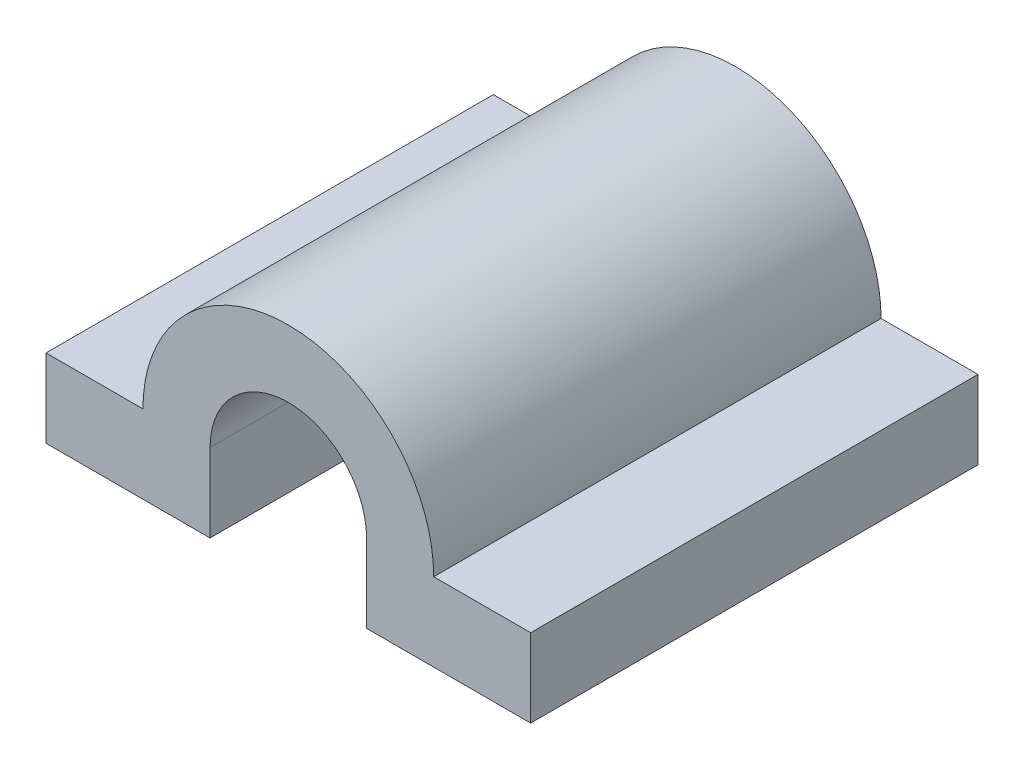
ISO-10303-21;
HEADER;
FILE_DESCRIPTION(('STEP AP214'),'2;1');
FILE_NAME('part.step','',(''),(''),'','','');
FILE_SCHEMA(('AUTOMOTIVE_DESIGN { 1 0 10303 214 1 1 1 1 }'));
ENDSEC;
DATA;
#1=APPLICATION_CONTEXT('core data for automotive mechanical design processes');
#2=APPLICATION_PROTOCOL_DEFINITION('international standard','automotive_design',2000,#1);
#3=PRODUCT_CONTEXT('',#1,'mechanical');
#4=PRODUCT('Part','Part','',(#3));
#5=PRODUCT_RELATED_PRODUCT_CATEGORY('part','',(#4));
#6=PRODUCT_DEFINITION_FORMATION('','',#4);
#7=PRODUCT_DEFINITION_CONTEXT('part definition',#1,'design');
#8=PRODUCT_DEFINITION('design','',#6,#7);
#9=PRODUCT_DEFINITION_SHAPE('','',#8);
#10=(LENGTH_UNIT() NAMED_UNIT(*) SI_UNIT(.MILLI.,.METRE.));
#11=(NAMED_UNIT(*) PLANE_ANGLE_UNIT() SI_UNIT($,.RADIAN.));
#12=(NAMED_UNIT(*) SI_UNIT($,.STERADIAN.) SOLID_ANGLE_UNIT());
#13=UNCERTAINTY_MEASURE_WITH_UNIT(LENGTH_MEASURE(1.E-05),#10,'distance_accuracy_value','');
#14=(GEOMETRIC_REPRESENTATION_CONTEXT(3) GLOBAL_UNCERTAINTY_ASSIGNED_CONTEXT((#13)) GLOBAL_UNIT_ASSIGNED_CONTEXT((#10,
#11,#12)) REPRESENTATION_CONTEXT('',''));
#15=CARTESIAN_POINT('',(0.,0.,0.));
#16=DIRECTION('',(0.,0.,1.));
#17=DIRECTION('',(1.,0.,0.));
#18=AXIS2_PLACEMENT_3D('',#15,#16,#17);
#19=CARTESIAN_POINT('',(0.,0.,12.));
#20=DIRECTION('',(0.,0.,-1.));
#21=DIRECTION('',(-1.,0.,0.));
#22=AXIS2_PLACEMENT_3D('',#19,#20,#21);
#23=CYLINDRICAL_SURFACE('',#22,2.10000000000001);
#24=CARTESIAN_POINT('',(0.,0.,0.));
#25=DIRECTION('',(0.,0.,-1.));
#26=DIRECTION('',(-1.,0.,0.));
#27=AXIS2_PLACEMENT_3D('',#24,#25,#26);
#28=CIRCLE('',#27,2.10000000000001);
#29=CARTESIAN_POINT('',(-2.1,0.,0.));
#30=VERTEX_POINT('',#29);
#31=CARTESIAN_POINT('',(2.10000000000002,0.,0.));
#32=VERTEX_POINT('',#31);
#33=EDGE_CURVE('E141',#30,#32,#28,.T.);
#34=ORIENTED_EDGE('',*,*,#33,.T.);
#35=DIRECTION('',(0.,0.,-1.));
#36=VECTOR('',#35,1.);
#37=CARTESIAN_POINT('',(2.10000000000002,0.,12.));
#38=LINE('',#37,#36);
#39=CARTESIAN_POINT('',(2.10000000000002,0.,12.));
#40=VERTEX_POINT('',#39);
#41=EDGE_CURVE('E11',#40,#32,#38,.T.);
#42=ORIENTED_EDGE('',*,*,#41,.F.);
#43=CARTESIAN_POINT('',(0.,0.,12.));
#44=DIRECTION('',(0.,0.,-1.));
#45=DIRECTION('',(-1.,0.,0.));
#46=AXIS2_PLACEMENT_3D('',#43,#44,#45);
#47=CIRCLE('',#46,2.10000000000001);
#48=CARTESIAN_POINT('',(-2.1,0.,12.));
#49=VERTEX_POINT('',#48);
#50=EDGE_CURVE('E159',#49,#40,#47,.T.);
#51=ORIENTED_EDGE('',*,*,#50,.F.);
#52=DIRECTION('',(0.,0.,-1.));
#53=VECTOR('',#52,1.);
#54=CARTESIAN_POINT('',(-2.1,0.,12.));
#55=LINE('',#54,#53);
#56=EDGE_CURVE('E137',#49,#30,#55,.T.);
#57=ORIENTED_EDGE('',*,*,#56,.T.);
#58=EDGE_LOOP('',(#34,#42,#51,#57));
#59=FACE_BOUND('',#58,.T.);
#60=ADVANCED_FACE('F33',(#59),#23,.F.);
#61=CARTESIAN_POINT('',(2.10000000000002,0.,12.));
#62=DIRECTION('',(1.,0.,0.));
#63=DIRECTION('',(0.,1.,0.));
#64=AXIS2_PLACEMENT_3D('',#61,#62,#63);
#65=PLANE('',#64);
#66=DIRECTION('',(0.,-1.,0.));
#67=VECTOR('',#66,1.);
#68=CARTESIAN_POINT('',(2.10000000000002,0.,0.));
#69=LINE('',#68,#67);
#70=CARTESIAN_POINT('',(2.10000000000002,-2.1,0.));
#71=VERTEX_POINT('',#70);
#72=EDGE_CURVE('E144',#32,#71,#69,.T.);
#73=ORIENTED_EDGE('',*,*,#72,.T.);
#74=DIRECTION('',(0.,0.,-1.));
#75=VECTOR('',#74,1.);
#76=CARTESIAN_POINT('',(2.10000000000002,-2.1,12.));
#77=LINE('',#76,#75);
#78=CARTESIAN_POINT('',(2.10000000000002,-2.1,12.));
#79=VERTEX_POINT('',#78);
#80=EDGE_CURVE('E41',#79,#71,#77,.T.);
#81=ORIENTED_EDGE('',*,*,#80,.F.);
#82=DIRECTION('',(0.,-1.,0.));
#83=VECTOR('',#82,1.);
#84=CARTESIAN_POINT('',(2.10000000000002,0.,12.));
#85=LINE('',#84,#83);
#86=EDGE_CURVE('E98',#40,#79,#85,.T.);
#87=ORIENTED_EDGE('',*,*,#86,.F.);
#88=ORIENTED_EDGE('',*,*,#41,.T.);
#89=EDGE_LOOP('',(#73,#81,#87,#88));
#90=FACE_BOUND('',#89,.T.);
#91=ADVANCED_FACE('F208',(#90),#65,.F.);
#92=CARTESIAN_POINT('',(2.10000000000002,-2.1,12.));
#93=DIRECTION('',(0.,1.,0.));
#94=DIRECTION('',(-1.,0.,0.));
#95=AXIS2_PLACEMENT_3D('',#92,#93,#94);
#96=PLANE('',#95);
#97=DIRECTION('',(1.,0.,0.));
#98=VECTOR('',#97,1.);
#99=CARTESIAN_POINT('',(2.10000000000002,-2.1,0.));
#100=LINE('',#99,#98);
#101=CARTESIAN_POINT('',(6.50000000000001,-2.1,0.));
#102=VERTEX_POINT('',#101);
#103=EDGE_CURVE('E146',#71,#102,#100,.T.);
#104=ORIENTED_EDGE('',*,*,#103,.T.);
#105=DIRECTION('',(0.,0.,-1.));
#106=VECTOR('',#105,1.);
#107=CARTESIAN_POINT('',(6.50000000000001,-2.1,12.));
#108=LINE('',#107,#106);
#109=CARTESIAN_POINT('',(6.50000000000001,-2.1,12.));
#110=VERTEX_POINT('',#109);
#111=EDGE_CURVE('E172',#110,#102,#108,.T.);
#112=ORIENTED_EDGE('',*,*,#111,.F.);
#113=DIRECTION('',(1.,0.,0.));
#114=VECTOR('',#113,1.);
#115=CARTESIAN_POINT('',(2.10000000000002,-2.1,12.));
#116=LINE('',#115,#114);
#117=EDGE_CURVE('E180',#79,#110,#116,.T.);
#118=ORIENTED_EDGE('',*,*,#117,.F.);
#119=ORIENTED_EDGE('',*,*,#80,.T.);
#120=EDGE_LOOP('',(#104,#112,#118,#119));
#121=FACE_BOUND('',#120,.T.);
#122=ADVANCED_FACE('F178',(#121),#96,.F.);
#123=CARTESIAN_POINT('',(6.50000000000001,-2.1,12.));
#124=DIRECTION('',(-1.,0.,0.));
#125=DIRECTION('',(0.,0.,1.));
#126=AXIS2_PLACEMENT_3D('',#123,#124,#125);
#127=PLANE('',#126);
#128=DIRECTION('',(0.,1.,0.));
#129=VECTOR('',#128,1.);
#130=CARTESIAN_POINT('',(6.50000000000001,-2.1,0.));
#131=LINE('',#130,#129);
#132=CARTESIAN_POINT('',(6.50000000000001,0.,0.));
#133=VERTEX_POINT('',#132);
#134=EDGE_CURVE('E148',#102,#133,#131,.T.);
#135=ORIENTED_EDGE('',*,*,#134,.T.);
#136=DIRECTION('',(0.,0.,-1.));
#137=VECTOR('',#136,1.);
#138=CARTESIAN_POINT('',(6.50000000000001,0.,12.));
#139=LINE('',#138,#137);
#140=CARTESIAN_POINT('',(6.50000000000001,0.,12.));
#141=VERTEX_POINT('',#140);
#142=EDGE_CURVE('E169',#141,#133,#139,.T.);
#143=ORIENTED_EDGE('',*,*,#142,.F.);
#144=DIRECTION('',(0.,1.,0.));
#145=VECTOR('',#144,1.);
#146=CARTESIAN_POINT('',(6.50000000000001,-2.1,12.));
#147=LINE('',#146,#145);
#148=EDGE_CURVE('E198',#110,#141,#147,.T.);
#149=ORIENTED_EDGE('',*,*,#148,.F.);
#150=ORIENTED_EDGE('',*,*,#111,.T.);
#151=EDGE_LOOP('',(#135,#143,#149,#150));
#152=FACE_BOUND('',#151,.T.);
#153=ADVANCED_FACE('F189',(#152),#127,.F.);
#154=CARTESIAN_POINT('',(6.50000000000001,0.,12.));
#155=DIRECTION('',(0.,-1.,0.));
#156=DIRECTION('',(1.,0.,0.));
#157=AXIS2_PLACEMENT_3D('',#154,#155,#156);
#158=PLANE('',#157);
#159=DIRECTION('',(-1.,0.,0.));
#160=VECTOR('',#159,1.);
#161=CARTESIAN_POINT('',(6.50000000000001,0.,0.));
#162=LINE('',#161,#160);
#163=CARTESIAN_POINT('',(3.90000000000001,0.,0.));
#164=VERTEX_POINT('',#163);
#165=EDGE_CURVE('E150',#133,#164,#162,.T.);
#166=ORIENTED_EDGE('',*,*,#165,.T.);
#167=DIRECTION('',(0.,0.,-1.));
#168=VECTOR('',#167,1.);
#169=CARTESIAN_POINT('',(3.90000000000001,0.,12.));
#170=LINE('',#169,#168);
#171=CARTESIAN_POINT('',(3.90000000000001,0.,12.));
#172=VERTEX_POINT('',#171);
#173=EDGE_CURVE('E166',#172,#164,#170,.T.);
#174=ORIENTED_EDGE('',*,*,#173,.F.);
#175=DIRECTION('',(-1.,0.,0.));
#176=VECTOR('',#175,1.);
#177=CARTESIAN_POINT('',(6.50000000000001,0.,12.));
#178=LINE('',#177,#176);
#179=EDGE_CURVE('E195',#141,#172,#178,.T.);
#180=ORIENTED_EDGE('',*,*,#179,.F.);
#181=ORIENTED_EDGE('',*,*,#142,.T.);
#182=EDGE_LOOP('',(#166,#174,#180,#181));
#183=FACE_BOUND('',#182,.T.);
#184=ADVANCED_FACE('F193',(#183),#158,.F.);
#185=CARTESIAN_POINT('',(0.,0.,12.));
#186=DIRECTION('',(0.,0.,-1.));
#187=DIRECTION('',(-1.,0.,0.));
#188=AXIS2_PLACEMENT_3D('',#185,#186,#187);
#189=CYLINDRICAL_SURFACE('',#188,3.90000000000001);
#190=CARTESIAN_POINT('',(0.,0.,0.));
#191=DIRECTION('',(0.,0.,1.));
#192=DIRECTION('',(-1.,0.,0.));
#193=AXIS2_PLACEMENT_3D('',#190,#191,#192);
#194=CIRCLE('',#193,3.90000000000001);
#195=CARTESIAN_POINT('',(-3.9,0.,0.));
#196=VERTEX_POINT('',#195);
#197=EDGE_CURVE('E152',#164,#196,#194,.T.);
#198=ORIENTED_EDGE('',*,*,#197,.T.);
#199=DIRECTION('',(0.,0.,-1.));
#200=VECTOR('',#199,1.);
#201=CARTESIAN_POINT('',(-3.9,0.,12.));
#202=LINE('',#201,#200);
#203=CARTESIAN_POINT('',(-3.9,0.,12.));
#204=VERTEX_POINT('',#203);
#205=EDGE_CURVE('E163',#204,#196,#202,.T.);
#206=ORIENTED_EDGE('',*,*,#205,.F.);
#207=CARTESIAN_POINT('',(0.,0.,12.));
#208=DIRECTION('',(0.,0.,1.));
#209=DIRECTION('',(-1.,0.,0.));
#210=AXIS2_PLACEMENT_3D('',#207,#208,#209);
#211=CIRCLE('',#210,3.90000000000001);
#212=EDGE_CURVE('E197',#172,#204,#211,.T.);
#213=ORIENTED_EDGE('',*,*,#212,.F.);
#214=ORIENTED_EDGE('',*,*,#173,.T.);
#215=EDGE_LOOP('',(#198,#206,#213,#214));
#216=FACE_BOUND('',#215,.T.);
#217=ADVANCED_FACE('F220',(#216),#189,.T.);
#218=CARTESIAN_POINT('',(-6.49999999999999,0.,12.));
#219=DIRECTION('',(0.,-1.,0.));
#220=DIRECTION('',(0.,0.,-1.));
#221=AXIS2_PLACEMENT_3D('',#218,#219,#220);
#222=PLANE('',#221);
#223=DIRECTION('',(-1.,0.,0.));
#224=VECTOR('',#223,1.);
#225=CARTESIAN_POINT('',(-6.49999999999999,0.,0.));
#226=LINE('',#225,#224);
#227=CARTESIAN_POINT('',(-6.49999999999999,0.,0.));
#228=VERTEX_POINT('',#227);
#229=EDGE_CURVE('E154',#196,#228,#226,.T.);
#230=ORIENTED_EDGE('',*,*,#229,.T.);
#231=DIRECTION('',(0.,0.,-1.));
#232=VECTOR('',#231,1.);
#233=CARTESIAN_POINT('',(-6.49999999999999,0.,12.));
#234=LINE('',#233,#232);
#235=CARTESIAN_POINT('',(-6.49999999999999,0.,12.));
#236=VERTEX_POINT('',#235);
#237=EDGE_CURVE('E132',#236,#228,#234,.T.);
#238=ORIENTED_EDGE('',*,*,#237,.F.);
#239=DIRECTION('',(-1.,0.,0.));
#240=VECTOR('',#239,1.);
#241=CARTESIAN_POINT('',(-6.49999999999999,0.,12.));
#242=LINE('',#241,#240);
#243=EDGE_CURVE('E123',#204,#236,#242,.T.);
#244=ORIENTED_EDGE('',*,*,#243,.F.);
#245=ORIENTED_EDGE('',*,*,#205,.T.);
#246=EDGE_LOOP('',(#230,#238,#244,#245));
#247=FACE_BOUND('',#246,.T.);
#248=ADVANCED_FACE('F223',(#247),#222,.F.);
#249=CARTESIAN_POINT('',(-6.49999999999999,-2.1,12.));
#250=DIRECTION('',(1.,0.,0.));
#251=DIRECTION('',(0.,0.,-1.));
#252=AXIS2_PLACEMENT_3D('',#249,#250,#251);
#253=PLANE('',#252);
#254=DIRECTION('',(0.,-1.,0.));
#255=VECTOR('',#254,1.);
#256=CARTESIAN_POINT('',(-6.49999999999999,-2.1,0.));
#257=LINE('',#256,#255);
#258=CARTESIAN_POINT('',(-6.49999999999999,-2.1,0.));
#259=VERTEX_POINT('',#258);
#260=EDGE_CURVE('E131',#228,#259,#257,.T.);
#261=ORIENTED_EDGE('',*,*,#260,.T.);
#262=DIRECTION('',(0.,0.,-1.));
#263=VECTOR('',#262,1.);
#264=CARTESIAN_POINT('',(-6.49999999999999,-2.1,12.));
#265=LINE('',#264,#263);
#266=CARTESIAN_POINT('',(-6.49999999999999,-2.1,12.));
#267=VERTEX_POINT('',#266);
#268=EDGE_CURVE('E128',#267,#259,#265,.T.);
#269=ORIENTED_EDGE('',*,*,#268,.F.);
#270=DIRECTION('',(0.,-1.,0.));
#271=VECTOR('',#270,1.);
#272=CARTESIAN_POINT('',(-6.49999999999999,-2.1,12.));
#273=LINE('',#272,#271);
#274=EDGE_CURVE('E117',#236,#267,#273,.T.);
#275=ORIENTED_EDGE('',*,*,#274,.F.);
#276=ORIENTED_EDGE('',*,*,#237,.T.);
#277=EDGE_LOOP('',(#261,#269,#275,#276));
#278=FACE_BOUND('',#277,.T.);
#279=ADVANCED_FACE('F129',(#278),#253,.F.);
#280=CARTESIAN_POINT('',(-2.1,-2.1,12.));
#281=DIRECTION('',(0.,1.,0.));
#282=DIRECTION('',(-1.,0.,0.));
#283=AXIS2_PLACEMENT_3D('',#280,#281,#282);
#284=PLANE('',#283);
#285=DIRECTION('',(1.,0.,0.));
#286=VECTOR('',#285,1.);
#287=CARTESIAN_POINT('',(-2.1,-2.1,0.));
#288=LINE('',#287,#286);
#289=CARTESIAN_POINT('',(-2.1,-2.1,0.));
#290=VERTEX_POINT('',#289);
#291=EDGE_CURVE('E84',#259,#290,#288,.T.);
#292=ORIENTED_EDGE('',*,*,#291,.T.);
#293=DIRECTION('',(0.,0.,-1.));
#294=VECTOR('',#293,1.);
#295=CARTESIAN_POINT('',(-2.1,-2.1,12.));
#296=LINE('',#295,#294);
#297=CARTESIAN_POINT('',(-2.1,-2.1,12.));
#298=VERTEX_POINT('',#297);
#299=EDGE_CURVE('E133',#298,#290,#296,.T.);
#300=ORIENTED_EDGE('',*,*,#299,.F.);
#301=DIRECTION('',(1.,0.,0.));
#302=VECTOR('',#301,1.);
#303=CARTESIAN_POINT('',(-2.1,-2.1,12.));
#304=LINE('',#303,#302);
#305=EDGE_CURVE('E121',#267,#298,#304,.T.);
#306=ORIENTED_EDGE('',*,*,#305,.F.);
#307=ORIENTED_EDGE('',*,*,#268,.T.);
#308=EDGE_LOOP('',(#292,#300,#306,#307));
#309=FACE_BOUND('',#308,.T.);
#310=ADVANCED_FACE('F135',(#309),#284,.F.);
#311=CARTESIAN_POINT('',(-2.1,0.,12.));
#312=DIRECTION('',(-1.,0.,0.));
#313=DIRECTION('',(0.,0.,1.));
#314=AXIS2_PLACEMENT_3D('',#311,#312,#313);
#315=PLANE('',#314);
#316=DIRECTION('',(0.,1.,0.));
#317=VECTOR('',#316,1.);
#318=CARTESIAN_POINT('',(-2.1,0.,0.));
#319=LINE('',#318,#317);
#320=EDGE_CURVE('E90',#290,#30,#319,.T.);
#321=ORIENTED_EDGE('',*,*,#320,.T.);
#322=ORIENTED_EDGE('',*,*,#56,.F.);
#323=DIRECTION('',(0.,1.,0.));
#324=VECTOR('',#323,1.);
#325=CARTESIAN_POINT('',(-2.1,0.,12.));
#326=LINE('',#325,#324);
#327=EDGE_CURVE('E49',#298,#49,#326,.T.);
#328=ORIENTED_EDGE('',*,*,#327,.F.);
#329=ORIENTED_EDGE('',*,*,#299,.T.);
#330=EDGE_LOOP('',(#321,#322,#328,#329));
#331=FACE_BOUND('',#330,.T.);
#332=ADVANCED_FACE('F232',(#331),#315,.F.);
#333=CARTESIAN_POINT('',(0.,0.,12.));
#334=DIRECTION('',(0.,0.,-1.));
#335=DIRECTION('',(-1.,0.,0.));
#336=AXIS2_PLACEMENT_3D('',#333,#334,#335);
#337=PLANE('',#336);
#338=ORIENTED_EDGE('',*,*,#50,.T.);
#339=ORIENTED_EDGE('',*,*,#86,.T.);
#340=ORIENTED_EDGE('',*,*,#117,.T.);
#341=ORIENTED_EDGE('',*,*,#148,.T.);
#342=ORIENTED_EDGE('',*,*,#179,.T.);
#343=ORIENTED_EDGE('',*,*,#212,.T.);
#344=ORIENTED_EDGE('',*,*,#243,.T.);
#345=ORIENTED_EDGE('',*,*,#274,.T.);
#346=ORIENTED_EDGE('',*,*,#305,.T.);
#347=ORIENTED_EDGE('',*,*,#327,.T.);
#348=EDGE_LOOP('',(#338,#339,#340,#341,#342,#343,#344,#345,#346,#347));
#349=FACE_BOUND('',#348,.T.);
#350=ADVANCED_FACE('F119',(#349),#337,.F.);
#351=CARTESIAN_POINT('',(0.,0.,0.));
#352=DIRECTION('',(0.,0.,-1.));
#353=DIRECTION('',(-1.,0.,0.));
#354=AXIS2_PLACEMENT_3D('',#351,#352,#353);
#355=PLANE('',#354);
#356=ORIENTED_EDGE('',*,*,#33,.F.);
#357=ORIENTED_EDGE('',*,*,#320,.F.);
#358=ORIENTED_EDGE('',*,*,#291,.F.);
#359=ORIENTED_EDGE('',*,*,#260,.F.);
#360=ORIENTED_EDGE('',*,*,#229,.F.);
#361=ORIENTED_EDGE('',*,*,#197,.F.);
#362=ORIENTED_EDGE('',*,*,#165,.F.);
#363=ORIENTED_EDGE('',*,*,#134,.F.);
#364=ORIENTED_EDGE('',*,*,#103,.F.);
#365=ORIENTED_EDGE('',*,*,#72,.F.);
#366=EDGE_LOOP('',(#356,#357,#358,#359,#360,#361,#362,#363,#364,#365));
#367=FACE_BOUND('',#366,.T.);
#368=ADVANCED_FACE('F184',(#367),#355,.T.);
#369=CLOSED_SHELL('',(#60,#91,#122,#153,#184,#217,#248,#279,#310,#332,#350,#368));
#370=MANIFOLD_SOLID_BREP('B2',#369);
#371=ADVANCED_BREP_SHAPE_REPRESENTATION('',(#18,#370),#14);
#372=SHAPE_DEFINITION_REPRESENTATION(#9,#371);
ENDSEC;
END-ISO-10303-21;
